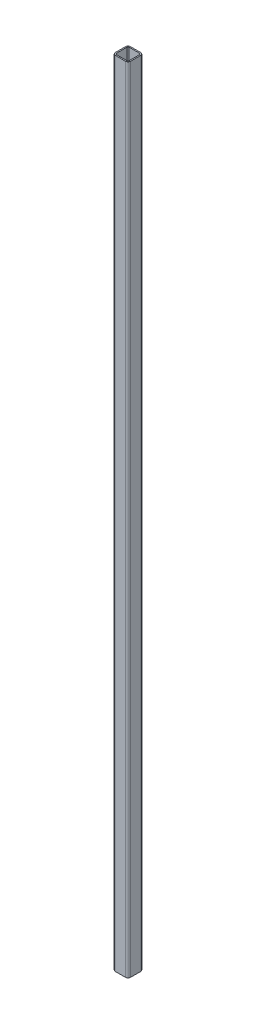
ISO-10303-21;
HEADER;
FILE_DESCRIPTION(('STEP AP214'),'2;1');
FILE_NAME('part.step','',(''),(''),'','','');
FILE_SCHEMA(('AUTOMOTIVE_DESIGN { 1 0 10303 214 1 1 1 1 }'));
ENDSEC;
DATA;
#1=APPLICATION_CONTEXT('core data for automotive mechanical design processes');
#2=APPLICATION_PROTOCOL_DEFINITION('international standard','automotive_design',2000,#1);
#3=PRODUCT_CONTEXT('',#1,'mechanical');
#4=PRODUCT('Part','Part','',(#3));
#5=PRODUCT_RELATED_PRODUCT_CATEGORY('part','',(#4));
#6=PRODUCT_DEFINITION_FORMATION('','',#4);
#7=PRODUCT_DEFINITION_CONTEXT('part definition',#1,'design');
#8=PRODUCT_DEFINITION('design','',#6,#7);
#9=PRODUCT_DEFINITION_SHAPE('','',#8);
#10=(LENGTH_UNIT() NAMED_UNIT(*) SI_UNIT(.MILLI.,.METRE.));
#11=(NAMED_UNIT(*) PLANE_ANGLE_UNIT() SI_UNIT($,.RADIAN.));
#12=(NAMED_UNIT(*) SI_UNIT($,.STERADIAN.) SOLID_ANGLE_UNIT());
#13=UNCERTAINTY_MEASURE_WITH_UNIT(LENGTH_MEASURE(1.E-05),#10,'distance_accuracy_value','');
#14=(GEOMETRIC_REPRESENTATION_CONTEXT(3) GLOBAL_UNCERTAINTY_ASSIGNED_CONTEXT((#13)) GLOBAL_UNIT_ASSIGNED_CONTEXT((#10,
#11,#12)) REPRESENTATION_CONTEXT('',''));
#15=CARTESIAN_POINT('',(0.,0.,0.));
#16=DIRECTION('',(0.,0.,1.));
#17=DIRECTION('',(1.,0.,0.));
#18=AXIS2_PLACEMENT_3D('',#15,#16,#17);
#19=CARTESIAN_POINT('',(-379.733333333333,-1220.,893.6));
#20=DIRECTION('',(0.,1.,0.));
#21=DIRECTION('',(0.,0.,1.));
#22=AXIS2_PLACEMENT_3D('',#19,#20,#21);
#23=CYLINDRICAL_SURFACE('',#22,6.39999999999996);
#24=CARTESIAN_POINT('',(-379.733333333333,890.,893.6));
#25=DIRECTION('',(0.,1.,0.));
#26=DIRECTION('',(0.,0.,1.));
#27=AXIS2_PLACEMENT_3D('',#24,#25,#26);
#28=CIRCLE('',#27,6.39999999999996);
#29=CARTESIAN_POINT('',(-379.733333333333,890.,900.));
#30=VERTEX_POINT('',#29);
#31=CARTESIAN_POINT('',(-373.333333333333,890.,893.6));
#32=VERTEX_POINT('',#31);
#33=EDGE_CURVE('E121',#30,#32,#28,.T.);
#34=ORIENTED_EDGE('',*,*,#33,.F.);
#35=DIRECTION('',(0.,1.,0.));
#36=VECTOR('',#35,1.);
#37=CARTESIAN_POINT('',(-379.733333333333,-1220.,900.));
#38=LINE('',#37,#36);
#39=CARTESIAN_POINT('',(-379.733333333333,-1200.,900.));
#40=VERTEX_POINT('',#39);
#41=EDGE_CURVE('E118',#30,#40,#38,.F.);
#42=ORIENTED_EDGE('',*,*,#41,.T.);
#43=CARTESIAN_POINT('',(-379.733333333333,-1200.,893.6));
#44=DIRECTION('',(0.,1.,0.));
#45=DIRECTION('',(0.,0.,1.));
#46=AXIS2_PLACEMENT_3D('',#43,#44,#45);
#47=CIRCLE('',#46,6.39999999999996);
#48=CARTESIAN_POINT('',(-373.333333333333,-1200.,893.6));
#49=VERTEX_POINT('',#48);
#50=EDGE_CURVE('E22',#49,#40,#47,.F.);
#51=ORIENTED_EDGE('',*,*,#50,.F.);
#52=DIRECTION('',(0.,-1.,0.));
#53=VECTOR('',#52,1.);
#54=CARTESIAN_POINT('',(-373.333333333333,-1220.,893.6));
#55=LINE('',#54,#53);
#56=EDGE_CURVE('E219',#49,#32,#55,.F.);
#57=ORIENTED_EDGE('',*,*,#56,.T.);
#58=EDGE_LOOP('',(#34,#42,#51,#57));
#59=FACE_BOUND('',#58,.T.);
#60=ADVANCED_FACE('F19',(#59),#23,.T.);
#61=CARTESIAN_POINT('',(-373.333333333333,-1220.,893.599999999999));
#62=DIRECTION('',(-1.,0.,0.));
#63=DIRECTION('',(0.,-1.,0.));
#64=AXIS2_PLACEMENT_3D('',#61,#62,#63);
#65=PLANE('',#64);
#66=DIRECTION('',(0.,0.,-1.));
#67=VECTOR('',#66,1.);
#68=CARTESIAN_POINT('',(-373.333333333333,-1200.,866.4));
#69=LINE('',#68,#67);
#70=CARTESIAN_POINT('',(-373.333333333333,-1200.,866.4));
#71=VERTEX_POINT('',#70);
#72=EDGE_CURVE('E140',#71,#49,#69,.F.);
#73=ORIENTED_EDGE('',*,*,#72,.F.);
#74=DIRECTION('',(0.,1.,0.));
#75=VECTOR('',#74,1.);
#76=CARTESIAN_POINT('',(-373.333333333333,-1220.,866.4));
#77=LINE('',#76,#75);
#78=CARTESIAN_POINT('',(-373.333333333333,890.,866.4));
#79=VERTEX_POINT('',#78);
#80=EDGE_CURVE('E217',#79,#71,#77,.F.);
#81=ORIENTED_EDGE('',*,*,#80,.F.);
#82=DIRECTION('',(0.,0.,1.));
#83=VECTOR('',#82,1.);
#84=CARTESIAN_POINT('',(-373.333333333333,890.,620.));
#85=LINE('',#84,#83);
#86=EDGE_CURVE('E194',#32,#79,#85,.F.);
#87=ORIENTED_EDGE('',*,*,#86,.F.);
#88=ORIENTED_EDGE('',*,*,#56,.F.);
#89=EDGE_LOOP('',(#73,#81,#87,#88));
#90=FACE_BOUND('',#89,.T.);
#91=ADVANCED_FACE('F279',(#90),#65,.F.);
#92=CARTESIAN_POINT('',(-379.733333333333,-1220.,866.4));
#93=DIRECTION('',(0.,1.,0.));
#94=DIRECTION('',(0.,0.,1.));
#95=AXIS2_PLACEMENT_3D('',#92,#93,#94);
#96=CYLINDRICAL_SURFACE('',#95,6.39999999999996);
#97=CARTESIAN_POINT('',(-379.733333333333,890.,866.4));
#98=DIRECTION('',(0.,1.,0.));
#99=DIRECTION('',(0.,0.,1.));
#100=AXIS2_PLACEMENT_3D('',#97,#98,#99);
#101=CIRCLE('',#100,6.39999999999996);
#102=CARTESIAN_POINT('',(-379.733333333333,890.,860.));
#103=VERTEX_POINT('',#102);
#104=EDGE_CURVE('E242',#79,#103,#101,.T.);
#105=ORIENTED_EDGE('',*,*,#104,.F.);
#106=ORIENTED_EDGE('',*,*,#80,.T.);
#107=CARTESIAN_POINT('',(-379.733333333333,-1200.,866.4));
#108=DIRECTION('',(0.,1.,0.));
#109=DIRECTION('',(0.,0.,1.));
#110=AXIS2_PLACEMENT_3D('',#107,#108,#109);
#111=CIRCLE('',#110,6.39999999999996);
#112=CARTESIAN_POINT('',(-379.733333333333,-1200.,860.));
#113=VERTEX_POINT('',#112);
#114=EDGE_CURVE('E170',#113,#71,#111,.F.);
#115=ORIENTED_EDGE('',*,*,#114,.F.);
#116=DIRECTION('',(0.,-1.,0.));
#117=VECTOR('',#116,1.);
#118=CARTESIAN_POINT('',(-379.733333333333,-1220.,860.));
#119=LINE('',#118,#117);
#120=EDGE_CURVE('E215',#113,#103,#119,.F.);
#121=ORIENTED_EDGE('',*,*,#120,.T.);
#122=EDGE_LOOP('',(#105,#106,#115,#121));
#123=FACE_BOUND('',#122,.T.);
#124=ADVANCED_FACE('F275',(#123),#96,.T.);
#125=CARTESIAN_POINT('',(-406.933333333333,-1220.,860.));
#126=DIRECTION('',(0.,0.,1.));
#127=DIRECTION('',(0.,-1.,0.));
#128=AXIS2_PLACEMENT_3D('',#125,#126,#127);
#129=PLANE('',#128);
#130=DIRECTION('',(1.,0.,0.));
#131=VECTOR('',#130,1.);
#132=CARTESIAN_POINT('',(1180.,-1200.,860.));
#133=LINE('',#132,#131);
#134=CARTESIAN_POINT('',(-406.933333333333,-1200.,860.));
#135=VERTEX_POINT('',#134);
#136=EDGE_CURVE('E166',#135,#113,#133,.T.);
#137=ORIENTED_EDGE('',*,*,#136,.F.);
#138=DIRECTION('',(0.,1.,0.));
#139=VECTOR('',#138,1.);
#140=CARTESIAN_POINT('',(-406.933333333333,-1220.,860.));
#141=LINE('',#140,#139);
#142=CARTESIAN_POINT('',(-406.933333333333,890.,860.));
#143=VERTEX_POINT('',#142);
#144=EDGE_CURVE('E213',#143,#135,#141,.F.);
#145=ORIENTED_EDGE('',*,*,#144,.F.);
#146=DIRECTION('',(1.,0.,0.));
#147=VECTOR('',#146,1.);
#148=CARTESIAN_POINT('',(-379.733333333333,890.,860.));
#149=LINE('',#148,#147);
#150=EDGE_CURVE('E241',#103,#143,#149,.F.);
#151=ORIENTED_EDGE('',*,*,#150,.F.);
#152=ORIENTED_EDGE('',*,*,#120,.F.);
#153=EDGE_LOOP('',(#137,#145,#151,#152));
#154=FACE_BOUND('',#153,.T.);
#155=ADVANCED_FACE('F270',(#154),#129,.F.);
#156=CARTESIAN_POINT('',(-406.933333333333,-1220.,866.4));
#157=DIRECTION('',(0.,1.,0.));
#158=DIRECTION('',(0.,0.,1.));
#159=AXIS2_PLACEMENT_3D('',#156,#157,#158);
#160=CYLINDRICAL_SURFACE('',#159,6.39999999999996);
#161=CARTESIAN_POINT('',(-406.933333333333,890.,866.4));
#162=DIRECTION('',(0.,1.,0.));
#163=DIRECTION('',(0.,0.,1.));
#164=AXIS2_PLACEMENT_3D('',#161,#162,#163);
#165=CIRCLE('',#164,6.39999999999996);
#166=CARTESIAN_POINT('',(-413.333333333333,890.,866.4));
#167=VERTEX_POINT('',#166);
#168=EDGE_CURVE('E238',#143,#167,#165,.T.);
#169=ORIENTED_EDGE('',*,*,#168,.F.);
#170=ORIENTED_EDGE('',*,*,#144,.T.);
#171=CARTESIAN_POINT('',(-406.933333333333,-1200.,866.4));
#172=DIRECTION('',(0.,1.,0.));
#173=DIRECTION('',(0.,0.,1.));
#174=AXIS2_PLACEMENT_3D('',#171,#172,#173);
#175=CIRCLE('',#174,6.39999999999996);
#176=CARTESIAN_POINT('',(-413.333333333333,-1200.,866.399999999999));
#177=VERTEX_POINT('',#176);
#178=EDGE_CURVE('E165',#177,#135,#175,.F.);
#179=ORIENTED_EDGE('',*,*,#178,.F.);
#180=DIRECTION('',(0.,1.,0.));
#181=VECTOR('',#180,1.);
#182=CARTESIAN_POINT('',(-413.333333333333,-1220.,866.399999999999));
#183=LINE('',#182,#181);
#184=EDGE_CURVE('E210',#177,#167,#183,.T.);
#185=ORIENTED_EDGE('',*,*,#184,.T.);
#186=EDGE_LOOP('',(#169,#170,#179,#185));
#187=FACE_BOUND('',#186,.T.);
#188=ADVANCED_FACE('F266',(#187),#160,.T.);
#189=CARTESIAN_POINT('',(-413.333333333333,-1220.,866.4));
#190=DIRECTION('',(1.,0.,0.));
#191=DIRECTION('',(0.,1.,0.));
#192=AXIS2_PLACEMENT_3D('',#189,#190,#191);
#193=PLANE('',#192);
#194=DIRECTION('',(0.,0.,-1.));
#195=VECTOR('',#194,1.);
#196=CARTESIAN_POINT('',(-413.333333333333,-1200.,866.4));
#197=LINE('',#196,#195);
#198=CARTESIAN_POINT('',(-413.333333333333,-1200.,893.599999999999));
#199=VERTEX_POINT('',#198);
#200=EDGE_CURVE('E162',#199,#177,#197,.T.);
#201=ORIENTED_EDGE('',*,*,#200,.F.);
#202=DIRECTION('',(0.,1.,0.));
#203=VECTOR('',#202,1.);
#204=CARTESIAN_POINT('',(-413.333333333333,-1220.,893.599999999999));
#205=LINE('',#204,#203);
#206=CARTESIAN_POINT('',(-413.333333333333,890.,893.6));
#207=VERTEX_POINT('',#206);
#208=EDGE_CURVE('E126',#207,#199,#205,.F.);
#209=ORIENTED_EDGE('',*,*,#208,.F.);
#210=DIRECTION('',(0.,0.,1.));
#211=VECTOR('',#210,1.);
#212=CARTESIAN_POINT('',(-413.333333333333,890.,620.));
#213=LINE('',#212,#211);
#214=EDGE_CURVE('E237',#167,#207,#213,.T.);
#215=ORIENTED_EDGE('',*,*,#214,.F.);
#216=ORIENTED_EDGE('',*,*,#184,.F.);
#217=EDGE_LOOP('',(#201,#209,#215,#216));
#218=FACE_BOUND('',#217,.T.);
#219=ADVANCED_FACE('F262',(#218),#193,.F.);
#220=CARTESIAN_POINT('',(-406.933333333333,-1220.,893.599999999999));
#221=DIRECTION('',(0.,1.,0.));
#222=DIRECTION('',(0.,0.,1.));
#223=AXIS2_PLACEMENT_3D('',#220,#221,#222);
#224=CYLINDRICAL_SURFACE('',#223,6.39999999999996);
#225=CARTESIAN_POINT('',(-406.933333333333,890.,893.6));
#226=DIRECTION('',(0.,1.,0.));
#227=DIRECTION('',(0.,0.,1.));
#228=AXIS2_PLACEMENT_3D('',#225,#226,#227);
#229=CIRCLE('',#228,6.39999999999996);
#230=CARTESIAN_POINT('',(-406.933333333333,890.,900.));
#231=VERTEX_POINT('',#230);
#232=EDGE_CURVE('E234',#207,#231,#229,.T.);
#233=ORIENTED_EDGE('',*,*,#232,.F.);
#234=ORIENTED_EDGE('',*,*,#208,.T.);
#235=CARTESIAN_POINT('',(-406.933333333333,-1200.,893.599999999999));
#236=DIRECTION('',(0.,1.,0.));
#237=DIRECTION('',(0.,0.,1.));
#238=AXIS2_PLACEMENT_3D('',#235,#236,#237);
#239=CIRCLE('',#238,6.39999999999996);
#240=CARTESIAN_POINT('',(-406.933333333333,-1200.,900.));
#241=VERTEX_POINT('',#240);
#242=EDGE_CURVE('E134',#241,#199,#239,.F.);
#243=ORIENTED_EDGE('',*,*,#242,.F.);
#244=DIRECTION('',(0.,1.,0.));
#245=VECTOR('',#244,1.);
#246=CARTESIAN_POINT('',(-406.933333333333,-1220.,900.));
#247=LINE('',#246,#245);
#248=EDGE_CURVE('E125',#241,#231,#247,.T.);
#249=ORIENTED_EDGE('',*,*,#248,.T.);
#250=EDGE_LOOP('',(#233,#234,#243,#249));
#251=FACE_BOUND('',#250,.T.);
#252=ADVANCED_FACE('F258',(#251),#224,.T.);
#253=CARTESIAN_POINT('',(-379.733333333333,-1220.,900.));
#254=DIRECTION('',(0.,0.,-1.));
#255=DIRECTION('',(0.,1.,0.));
#256=AXIS2_PLACEMENT_3D('',#253,#254,#255);
#257=PLANE('',#256);
#258=DIRECTION('',(1.,0.,0.));
#259=VECTOR('',#258,1.);
#260=CARTESIAN_POINT('',(1180.,-1200.,900.));
#261=LINE('',#260,#259);
#262=EDGE_CURVE('E129',#40,#241,#261,.F.);
#263=ORIENTED_EDGE('',*,*,#262,.F.);
#264=ORIENTED_EDGE('',*,*,#41,.F.);
#265=DIRECTION('',(1.,0.,0.));
#266=VECTOR('',#265,1.);
#267=CARTESIAN_POINT('',(-379.733333333333,890.,900.));
#268=LINE('',#267,#266);
#269=EDGE_CURVE('E233',#231,#30,#268,.T.);
#270=ORIENTED_EDGE('',*,*,#269,.F.);
#271=ORIENTED_EDGE('',*,*,#248,.F.);
#272=EDGE_LOOP('',(#263,#264,#270,#271));
#273=FACE_BOUND('',#272,.T.);
#274=ADVANCED_FACE('F130',(#273),#257,.F.);
#275=CARTESIAN_POINT('',(-410.133333333333,-1220.,866.4));
#276=DIRECTION('',(1.,0.,0.));
#277=DIRECTION('',(0.,1.,0.));
#278=AXIS2_PLACEMENT_3D('',#275,#276,#277);
#279=PLANE('',#278);
#280=DIRECTION('',(0.,1.,0.));
#281=VECTOR('',#280,1.);
#282=CARTESIAN_POINT('',(-410.133333333333,-1220.,866.4));
#283=LINE('',#282,#281);
#284=CARTESIAN_POINT('',(-410.133333333333,-1200.,866.4));
#285=VERTEX_POINT('',#284);
#286=CARTESIAN_POINT('',(-410.133333333333,890.,866.4));
#287=VERTEX_POINT('',#286);
#288=EDGE_CURVE('E201',#285,#287,#283,.T.);
#289=ORIENTED_EDGE('',*,*,#288,.T.);
#290=DIRECTION('',(0.,0.,1.));
#291=VECTOR('',#290,1.);
#292=CARTESIAN_POINT('',(-410.133333333333,890.,620.));
#293=LINE('',#292,#291);
#294=CARTESIAN_POINT('',(-410.133333333333,890.,893.6));
#295=VERTEX_POINT('',#294);
#296=EDGE_CURVE('E231',#295,#287,#293,.F.);
#297=ORIENTED_EDGE('',*,*,#296,.F.);
#298=DIRECTION('',(0.,1.,0.));
#299=VECTOR('',#298,1.);
#300=CARTESIAN_POINT('',(-410.133333333333,-1220.,893.6));
#301=LINE('',#300,#299);
#302=CARTESIAN_POINT('',(-410.133333333333,-1200.,893.6));
#303=VERTEX_POINT('',#302);
#304=EDGE_CURVE('E205',#295,#303,#301,.F.);
#305=ORIENTED_EDGE('',*,*,#304,.T.);
#306=DIRECTION('',(0.,0.,-1.));
#307=VECTOR('',#306,1.);
#308=CARTESIAN_POINT('',(-410.133333333333,-1200.,866.4));
#309=LINE('',#308,#307);
#310=EDGE_CURVE('E172',#285,#303,#309,.F.);
#311=ORIENTED_EDGE('',*,*,#310,.F.);
#312=EDGE_LOOP('',(#289,#297,#305,#311));
#313=FACE_BOUND('',#312,.T.);
#314=ADVANCED_FACE('F314',(#313),#279,.T.);
#315=CARTESIAN_POINT('',(-406.933333333333,-1220.,866.4));
#316=DIRECTION('',(0.,1.,0.));
#317=DIRECTION('',(0.,0.,1.));
#318=AXIS2_PLACEMENT_3D('',#315,#316,#317);
#319=CYLINDRICAL_SURFACE('',#318,3.19999999999998);
#320=ORIENTED_EDGE('',*,*,#288,.F.);
#321=CARTESIAN_POINT('',(-406.933333333333,-1200.,866.4));
#322=DIRECTION('',(0.,1.,0.));
#323=DIRECTION('',(0.,0.,1.));
#324=AXIS2_PLACEMENT_3D('',#321,#322,#323);
#325=CIRCLE('',#324,3.19999999999998);
#326=CARTESIAN_POINT('',(-406.933333333333,-1200.,863.199999999999));
#327=VERTEX_POINT('',#326);
#328=EDGE_CURVE('E183',#327,#285,#325,.T.);
#329=ORIENTED_EDGE('',*,*,#328,.F.);
#330=DIRECTION('',(0.,-1.,0.));
#331=VECTOR('',#330,1.);
#332=CARTESIAN_POINT('',(-406.933333333333,-1220.,863.199999999999));
#333=LINE('',#332,#331);
#334=CARTESIAN_POINT('',(-406.933333333333,890.,863.2));
#335=VERTEX_POINT('',#334);
#336=EDGE_CURVE('E200',#335,#327,#333,.T.);
#337=ORIENTED_EDGE('',*,*,#336,.F.);
#338=CARTESIAN_POINT('',(-406.933333333333,890.,866.4));
#339=DIRECTION('',(0.,1.,0.));
#340=DIRECTION('',(0.,0.,1.));
#341=AXIS2_PLACEMENT_3D('',#338,#339,#340);
#342=CIRCLE('',#341,3.19999999999998);
#343=EDGE_CURVE('E228',#287,#335,#342,.F.);
#344=ORIENTED_EDGE('',*,*,#343,.F.);
#345=EDGE_LOOP('',(#320,#329,#337,#344));
#346=FACE_BOUND('',#345,.T.);
#347=ADVANCED_FACE('F310',(#346),#319,.F.);
#348=CARTESIAN_POINT('',(-406.933333333333,-1220.,863.199999999999));
#349=DIRECTION('',(0.,0.,1.));
#350=DIRECTION('',(0.,-1.,0.));
#351=AXIS2_PLACEMENT_3D('',#348,#349,#350);
#352=PLANE('',#351);
#353=DIRECTION('',(0.,1.,0.));
#354=VECTOR('',#353,1.);
#355=CARTESIAN_POINT('',(-379.733333333333,-1220.,863.199999999999));
#356=LINE('',#355,#354);
#357=CARTESIAN_POINT('',(-379.733333333333,-1200.,863.199999999999));
#358=VERTEX_POINT('',#357);
#359=CARTESIAN_POINT('',(-379.733333333333,890.,863.2));
#360=VERTEX_POINT('',#359);
#361=EDGE_CURVE('E150',#358,#360,#356,.T.);
#362=ORIENTED_EDGE('',*,*,#361,.T.);
#363=DIRECTION('',(1.,0.,0.));
#364=VECTOR('',#363,1.);
#365=CARTESIAN_POINT('',(-379.733333333333,890.,863.2));
#366=LINE('',#365,#364);
#367=EDGE_CURVE('E227',#335,#360,#366,.T.);
#368=ORIENTED_EDGE('',*,*,#367,.F.);
#369=ORIENTED_EDGE('',*,*,#336,.T.);
#370=DIRECTION('',(1.,0.,0.));
#371=VECTOR('',#370,1.);
#372=CARTESIAN_POINT('',(1180.,-1200.,863.199999999999));
#373=LINE('',#372,#371);
#374=EDGE_CURVE('E180',#358,#327,#373,.F.);
#375=ORIENTED_EDGE('',*,*,#374,.F.);
#376=EDGE_LOOP('',(#362,#368,#369,#375));
#377=FACE_BOUND('',#376,.T.);
#378=ADVANCED_FACE('F313',(#377),#352,.T.);
#379=CARTESIAN_POINT('',(-379.733333333333,-1220.,866.4));
#380=DIRECTION('',(0.,1.,0.));
#381=DIRECTION('',(0.,0.,1.));
#382=AXIS2_PLACEMENT_3D('',#379,#380,#381);
#383=CYLINDRICAL_SURFACE('',#382,3.19999999999998);
#384=ORIENTED_EDGE('',*,*,#361,.F.);
#385=CARTESIAN_POINT('',(-379.733333333333,-1200.,866.4));
#386=DIRECTION('',(0.,1.,0.));
#387=DIRECTION('',(0.,0.,1.));
#388=AXIS2_PLACEMENT_3D('',#385,#386,#387);
#389=CIRCLE('',#388,3.19999999999998);
#390=CARTESIAN_POINT('',(-376.533333333333,-1200.,866.399999999999));
#391=VERTEX_POINT('',#390);
#392=EDGE_CURVE('E179',#391,#358,#389,.T.);
#393=ORIENTED_EDGE('',*,*,#392,.F.);
#394=DIRECTION('',(0.,-1.,0.));
#395=VECTOR('',#394,1.);
#396=CARTESIAN_POINT('',(-376.533333333333,-1220.,866.399999999999));
#397=LINE('',#396,#395);
#398=CARTESIAN_POINT('',(-376.533333333333,890.,866.4));
#399=VERTEX_POINT('',#398);
#400=EDGE_CURVE('E143',#399,#391,#397,.T.);
#401=ORIENTED_EDGE('',*,*,#400,.F.);
#402=CARTESIAN_POINT('',(-379.733333333333,890.,866.4));
#403=DIRECTION('',(0.,1.,0.));
#404=DIRECTION('',(0.,0.,1.));
#405=AXIS2_PLACEMENT_3D('',#402,#403,#404);
#406=CIRCLE('',#405,3.19999999999998);
#407=EDGE_CURVE('E224',#360,#399,#406,.F.);
#408=ORIENTED_EDGE('',*,*,#407,.F.);
#409=EDGE_LOOP('',(#384,#393,#401,#408));
#410=FACE_BOUND('',#409,.T.);
#411=ADVANCED_FACE('F332',(#410),#383,.F.);
#412=CARTESIAN_POINT('',(-376.533333333333,-1220.,893.6));
#413=DIRECTION('',(-1.,0.,0.));
#414=DIRECTION('',(0.,-1.,0.));
#415=AXIS2_PLACEMENT_3D('',#412,#413,#414);
#416=PLANE('',#415);
#417=DIRECTION('',(0.,1.,0.));
#418=VECTOR('',#417,1.);
#419=CARTESIAN_POINT('',(-376.533333333333,-1220.,893.6));
#420=LINE('',#419,#418);
#421=CARTESIAN_POINT('',(-376.533333333333,-1200.,893.6));
#422=VERTEX_POINT('',#421);
#423=CARTESIAN_POINT('',(-376.533333333333,890.,893.6));
#424=VERTEX_POINT('',#423);
#425=EDGE_CURVE('E141',#422,#424,#420,.T.);
#426=ORIENTED_EDGE('',*,*,#425,.T.);
#427=DIRECTION('',(0.,0.,1.));
#428=VECTOR('',#427,1.);
#429=CARTESIAN_POINT('',(-376.533333333333,890.,620.));
#430=LINE('',#429,#428);
#431=EDGE_CURVE('E223',#399,#424,#430,.T.);
#432=ORIENTED_EDGE('',*,*,#431,.F.);
#433=ORIENTED_EDGE('',*,*,#400,.T.);
#434=DIRECTION('',(0.,0.,-1.));
#435=VECTOR('',#434,1.);
#436=CARTESIAN_POINT('',(-376.533333333333,-1200.,866.4));
#437=LINE('',#436,#435);
#438=EDGE_CURVE('E176',#422,#391,#437,.T.);
#439=ORIENTED_EDGE('',*,*,#438,.F.);
#440=EDGE_LOOP('',(#426,#432,#433,#439));
#441=FACE_BOUND('',#440,.T.);
#442=ADVANCED_FACE('F294',(#441),#416,.T.);
#443=CARTESIAN_POINT('',(-379.733333333333,-1220.,893.6));
#444=DIRECTION('',(0.,1.,0.));
#445=DIRECTION('',(0.,0.,1.));
#446=AXIS2_PLACEMENT_3D('',#443,#444,#445);
#447=CYLINDRICAL_SURFACE('',#446,3.19999999999998);
#448=ORIENTED_EDGE('',*,*,#425,.F.);
#449=CARTESIAN_POINT('',(-379.733333333333,-1200.,893.6));
#450=DIRECTION('',(0.,1.,0.));
#451=DIRECTION('',(0.,0.,1.));
#452=AXIS2_PLACEMENT_3D('',#449,#450,#451);
#453=CIRCLE('',#452,3.19999999999998);
#454=CARTESIAN_POINT('',(-379.733333333333,-1200.,896.8));
#455=VERTEX_POINT('',#454);
#456=EDGE_CURVE('E175',#455,#422,#453,.T.);
#457=ORIENTED_EDGE('',*,*,#456,.F.);
#458=DIRECTION('',(0.,1.,0.));
#459=VECTOR('',#458,1.);
#460=CARTESIAN_POINT('',(-379.733333333332,-1220.,896.8));
#461=LINE('',#460,#459);
#462=CARTESIAN_POINT('',(-379.733333333333,890.,896.8));
#463=VERTEX_POINT('',#462);
#464=EDGE_CURVE('E187',#463,#455,#461,.F.);
#465=ORIENTED_EDGE('',*,*,#464,.F.);
#466=CARTESIAN_POINT('',(-379.733333333333,890.,893.6));
#467=DIRECTION('',(0.,1.,0.));
#468=DIRECTION('',(0.,0.,1.));
#469=AXIS2_PLACEMENT_3D('',#466,#467,#468);
#470=CIRCLE('',#469,3.19999999999998);
#471=EDGE_CURVE('E189',#424,#463,#470,.F.);
#472=ORIENTED_EDGE('',*,*,#471,.F.);
#473=EDGE_LOOP('',(#448,#457,#465,#472));
#474=FACE_BOUND('',#473,.T.);
#475=ADVANCED_FACE('F323',(#474),#447,.F.);
#476=CARTESIAN_POINT('',(1180.,-1200.,866.4));
#477=DIRECTION('',(0.,-1.,0.));
#478=DIRECTION('',(0.,0.,-1.));
#479=AXIS2_PLACEMENT_3D('',#476,#477,#478);
#480=PLANE('',#479);
#481=ORIENTED_EDGE('',*,*,#374,.T.);
#482=ORIENTED_EDGE('',*,*,#328,.T.);
#483=ORIENTED_EDGE('',*,*,#310,.T.);
#484=CARTESIAN_POINT('',(-406.933333333333,-1200.,893.599999999999));
#485=DIRECTION('',(0.,1.,0.));
#486=DIRECTION('',(0.,0.,1.));
#487=AXIS2_PLACEMENT_3D('',#484,#485,#486);
#488=CIRCLE('',#487,3.19999999999998);
#489=CARTESIAN_POINT('',(-406.933333333333,-1200.,896.8));
#490=VERTEX_POINT('',#489);
#491=EDGE_CURVE('E207',#303,#490,#488,.T.);
#492=ORIENTED_EDGE('',*,*,#491,.T.);
#493=DIRECTION('',(1.,0.,0.));
#494=VECTOR('',#493,1.);
#495=CARTESIAN_POINT('',(-379.733333333333,-1200.,896.8));
#496=LINE('',#495,#494);
#497=EDGE_CURVE('E184',#455,#490,#496,.F.);
#498=ORIENTED_EDGE('',*,*,#497,.F.);
#499=ORIENTED_EDGE('',*,*,#456,.T.);
#500=ORIENTED_EDGE('',*,*,#438,.T.);
#501=ORIENTED_EDGE('',*,*,#392,.T.);
#502=EDGE_LOOP('',(#481,#482,#483,#492,#498,#499,#500,#501));
#503=FACE_BOUND('',#502,.T.);
#504=ORIENTED_EDGE('',*,*,#114,.T.);
#505=ORIENTED_EDGE('',*,*,#72,.T.);
#506=ORIENTED_EDGE('',*,*,#50,.T.);
#507=ORIENTED_EDGE('',*,*,#262,.T.);
#508=ORIENTED_EDGE('',*,*,#242,.T.);
#509=ORIENTED_EDGE('',*,*,#200,.T.);
#510=ORIENTED_EDGE('',*,*,#178,.T.);
#511=ORIENTED_EDGE('',*,*,#136,.T.);
#512=EDGE_LOOP('',(#504,#505,#506,#507,#508,#509,#510,#511));
#513=FACE_BOUND('',#512,.T.);
#514=ADVANCED_FACE('F138',(#503,#513),#480,.T.);
#515=CARTESIAN_POINT('',(-406.933333333333,-1220.,893.599999999999));
#516=DIRECTION('',(0.,1.,0.));
#517=DIRECTION('',(0.,0.,1.));
#518=AXIS2_PLACEMENT_3D('',#515,#516,#517);
#519=CYLINDRICAL_SURFACE('',#518,3.19999999999998);
#520=DIRECTION('',(0.,1.,0.));
#521=VECTOR('',#520,1.);
#522=CARTESIAN_POINT('',(-406.933333333333,-1220.,896.8));
#523=LINE('',#522,#521);
#524=CARTESIAN_POINT('',(-406.933333333333,890.,896.8));
#525=VERTEX_POINT('',#524);
#526=EDGE_CURVE('E28',#490,#525,#523,.T.);
#527=ORIENTED_EDGE('',*,*,#526,.F.);
#528=ORIENTED_EDGE('',*,*,#491,.F.);
#529=ORIENTED_EDGE('',*,*,#304,.F.);
#530=CARTESIAN_POINT('',(-406.933333333333,890.,893.6));
#531=DIRECTION('',(0.,1.,0.));
#532=DIRECTION('',(0.,0.,1.));
#533=AXIS2_PLACEMENT_3D('',#530,#531,#532);
#534=CIRCLE('',#533,3.19999999999998);
#535=EDGE_CURVE('E37',#525,#295,#534,.F.);
#536=ORIENTED_EDGE('',*,*,#535,.F.);
#537=EDGE_LOOP('',(#527,#528,#529,#536));
#538=FACE_BOUND('',#537,.T.);
#539=ADVANCED_FACE('F318',(#538),#519,.F.);
#540=CARTESIAN_POINT('',(-379.733333333333,890.,620.));
#541=DIRECTION('',(0.,1.,0.));
#542=DIRECTION('',(0.,0.,1.));
#543=AXIS2_PLACEMENT_3D('',#540,#541,#542);
#544=PLANE('',#543);
#545=ORIENTED_EDGE('',*,*,#471,.T.);
#546=DIRECTION('',(1.,0.,0.));
#547=VECTOR('',#546,1.);
#548=CARTESIAN_POINT('',(-379.733333333333,890.,896.8));
#549=LINE('',#548,#547);
#550=EDGE_CURVE('E12',#525,#463,#549,.T.);
#551=ORIENTED_EDGE('',*,*,#550,.F.);
#552=ORIENTED_EDGE('',*,*,#535,.T.);
#553=ORIENTED_EDGE('',*,*,#296,.T.);
#554=ORIENTED_EDGE('',*,*,#343,.T.);
#555=ORIENTED_EDGE('',*,*,#367,.T.);
#556=ORIENTED_EDGE('',*,*,#407,.T.);
#557=ORIENTED_EDGE('',*,*,#431,.T.);
#558=EDGE_LOOP('',(#545,#551,#552,#553,#554,#555,#556,#557));
#559=FACE_BOUND('',#558,.T.);
#560=ORIENTED_EDGE('',*,*,#232,.T.);
#561=ORIENTED_EDGE('',*,*,#269,.T.);
#562=ORIENTED_EDGE('',*,*,#33,.T.);
#563=ORIENTED_EDGE('',*,*,#86,.T.);
#564=ORIENTED_EDGE('',*,*,#104,.T.);
#565=ORIENTED_EDGE('',*,*,#150,.T.);
#566=ORIENTED_EDGE('',*,*,#168,.T.);
#567=ORIENTED_EDGE('',*,*,#214,.T.);
#568=EDGE_LOOP('',(#560,#561,#562,#563,#564,#565,#566,#567));
#569=FACE_BOUND('',#568,.T.);
#570=ADVANCED_FACE('F281',(#559,#569),#544,.T.);
#571=CARTESIAN_POINT('',(-379.733333333333,-1220.,896.8));
#572=DIRECTION('',(0.,0.,-1.));
#573=DIRECTION('',(0.,1.,0.));
#574=AXIS2_PLACEMENT_3D('',#571,#572,#573);
#575=PLANE('',#574);
#576=ORIENTED_EDGE('',*,*,#526,.T.);
#577=ORIENTED_EDGE('',*,*,#550,.T.);
#578=ORIENTED_EDGE('',*,*,#464,.T.);
#579=ORIENTED_EDGE('',*,*,#497,.T.);
#580=EDGE_LOOP('',(#576,#577,#578,#579));
#581=FACE_BOUND('',#580,.T.);
#582=ADVANCED_FACE('F320',(#581),#575,.T.);
#583=CLOSED_SHELL('',(#60,#91,#124,#155,#188,#219,#252,#274,#314,#347,#378,#411,#442,#475,#514,
#539,#570,#582));
#584=MANIFOLD_SOLID_BREP('B1',#583);
#585=ADVANCED_BREP_SHAPE_REPRESENTATION('',(#18,#584),#14);
#586=SHAPE_DEFINITION_REPRESENTATION(#9,#585);
ENDSEC;
END-ISO-10303-21;
